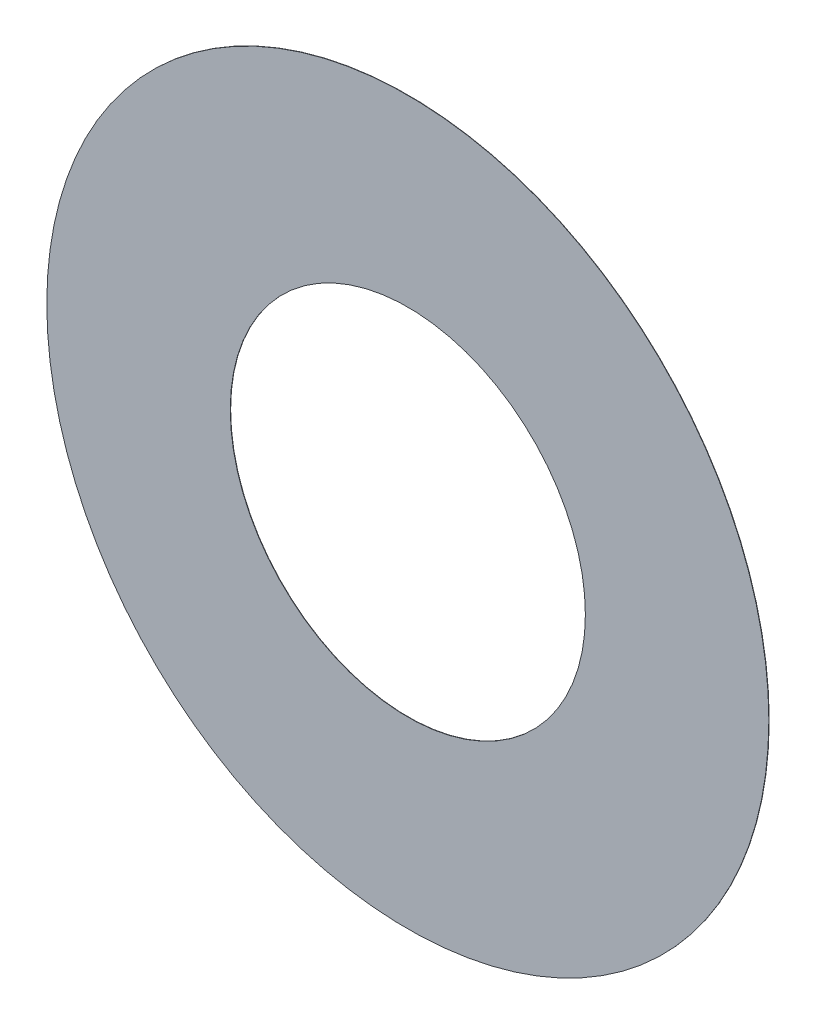
ISO-10303-21;
HEADER;
FILE_DESCRIPTION(('STEP AP214'),'2;1');
FILE_NAME('part.step','',(''),(''),'','','');
FILE_SCHEMA(('AUTOMOTIVE_DESIGN { 1 0 10303 214 1 1 1 1 }'));
ENDSEC;
DATA;
#1=APPLICATION_CONTEXT('core data for automotive mechanical design processes');
#2=APPLICATION_PROTOCOL_DEFINITION('international standard','automotive_design',2000,#1);
#3=PRODUCT_CONTEXT('',#1,'mechanical');
#4=PRODUCT('Part','Part','',(#3));
#5=PRODUCT_RELATED_PRODUCT_CATEGORY('part','',(#4));
#6=PRODUCT_DEFINITION_FORMATION('','',#4);
#7=PRODUCT_DEFINITION_CONTEXT('part definition',#1,'design');
#8=PRODUCT_DEFINITION('design','',#6,#7);
#9=PRODUCT_DEFINITION_SHAPE('','',#8);
#10=(LENGTH_UNIT() NAMED_UNIT(*) SI_UNIT(.MILLI.,.METRE.));
#11=(NAMED_UNIT(*) PLANE_ANGLE_UNIT() SI_UNIT($,.RADIAN.));
#12=(NAMED_UNIT(*) SI_UNIT($,.STERADIAN.) SOLID_ANGLE_UNIT());
#13=UNCERTAINTY_MEASURE_WITH_UNIT(LENGTH_MEASURE(1.E-05),#10,'distance_accuracy_value','');
#14=(GEOMETRIC_REPRESENTATION_CONTEXT(3) GLOBAL_UNCERTAINTY_ASSIGNED_CONTEXT((#13)) GLOBAL_UNIT_ASSIGNED_CONTEXT((#10,
#11,#12)) REPRESENTATION_CONTEXT('',''));
#15=CARTESIAN_POINT('',(0.,0.,0.));
#16=DIRECTION('',(0.,0.,1.));
#17=DIRECTION('',(1.,0.,0.));
#18=AXIS2_PLACEMENT_3D('',#15,#16,#17);
#19=CARTESIAN_POINT('',(0.,0.,0.0761999999999985));
#20=DIRECTION('',(0.,0.,1.));
#21=DIRECTION('',(1.,0.,0.));
#22=AXIS2_PLACEMENT_3D('',#19,#20,#21);
#23=PLANE('',#22);
#24=CARTESIAN_POINT('',(0.,0.,0.0761999999999985));
#25=DIRECTION('',(0.,0.,1.));
#26=DIRECTION('',(1.,0.,0.));
#27=AXIS2_PLACEMENT_3D('',#24,#25,#26);
#28=CIRCLE('',#27,77.47);
#29=CARTESIAN_POINT('',(-77.47,0.,0.0761999999999985));
#30=VERTEX_POINT('',#29);
#31=EDGE_CURVE('E10',#30,#30,#28,.T.);
#32=ORIENTED_EDGE('',*,*,#31,.T.);
#33=EDGE_LOOP('',(#32));
#34=FACE_BOUND('',#33,.T.);
#35=CARTESIAN_POINT('',(0.,0.,0.0761999999999985));
#36=DIRECTION('',(0.,0.,1.));
#37=DIRECTION('',(1.,0.,0.));
#38=AXIS2_PLACEMENT_3D('',#35,#36,#37);
#39=CIRCLE('',#38,38.1);
#40=CARTESIAN_POINT('',(-38.1,0.,0.0761999999999985));
#41=VERTEX_POINT('',#40);
#42=EDGE_CURVE('E41',#41,#41,#39,.T.);
#43=ORIENTED_EDGE('',*,*,#42,.F.);
#44=EDGE_LOOP('',(#43));
#45=FACE_BOUND('',#44,.T.);
#46=ADVANCED_FACE('F30',(#34,#45),#23,.T.);
#47=CARTESIAN_POINT('',(0.,0.,0.));
#48=DIRECTION('',(0.,0.,1.));
#49=DIRECTION('',(1.,0.,0.));
#50=AXIS2_PLACEMENT_3D('',#47,#48,#49);
#51=PLANE('',#50);
#52=CARTESIAN_POINT('',(0.,0.,0.));
#53=DIRECTION('',(0.,0.,1.));
#54=DIRECTION('',(1.,0.,0.));
#55=AXIS2_PLACEMENT_3D('',#52,#53,#54);
#56=CIRCLE('',#55,77.47);
#57=CARTESIAN_POINT('',(-77.47,0.,0.));
#58=VERTEX_POINT('',#57);
#59=EDGE_CURVE('E34',#58,#58,#56,.T.);
#60=ORIENTED_EDGE('',*,*,#59,.F.);
#61=EDGE_LOOP('',(#60));
#62=FACE_BOUND('',#61,.T.);
#63=CARTESIAN_POINT('',(0.,0.,0.));
#64=DIRECTION('',(0.,0.,1.));
#65=DIRECTION('',(1.,0.,0.));
#66=AXIS2_PLACEMENT_3D('',#63,#64,#65);
#67=CIRCLE('',#66,38.1);
#68=CARTESIAN_POINT('',(-38.1,0.,0.));
#69=VERTEX_POINT('',#68);
#70=EDGE_CURVE('E43',#69,#69,#67,.T.);
#71=ORIENTED_EDGE('',*,*,#70,.T.);
#72=EDGE_LOOP('',(#71));
#73=FACE_BOUND('',#72,.T.);
#74=ADVANCED_FACE('F53',(#62,#73),#51,.F.);
#75=CARTESIAN_POINT('',(0.,0.,0.0761999999999985));
#76=DIRECTION('',(0.,0.,-1.));
#77=DIRECTION('',(-1.,0.,0.));
#78=AXIS2_PLACEMENT_3D('',#75,#76,#77);
#79=CYLINDRICAL_SURFACE('',#78,77.47);
#80=CARTESIAN_POINT('',(-77.47,0.,0.0761999999999985));
#81=CARTESIAN_POINT('',(-77.47,0.,0.0754062499999985));
#82=CARTESIAN_POINT('',(-77.47,0.,0.0746124999999985));
#83=CARTESIAN_POINT('',(-77.47,0.,0.0730249999999985));
#84=CARTESIAN_POINT('',(-77.47,0.,0.0722312499999986));
#85=CARTESIAN_POINT('',(-77.47,0.,0.0706437499999986));
#86=CARTESIAN_POINT('',(-77.47,0.,0.0698499999999986));
#87=CARTESIAN_POINT('',(-77.47,0.,0.0682624999999986));
#88=CARTESIAN_POINT('',(-77.47,0.,0.0674687499999987));
#89=CARTESIAN_POINT('',(-77.47,0.,0.0658812499999987));
#90=CARTESIAN_POINT('',(-77.47,0.,0.0650874999999987));
#91=CARTESIAN_POINT('',(-77.47,0.,0.0634999999999987));
#92=CARTESIAN_POINT('',(-77.47,0.,0.0627062499999988));
#93=CARTESIAN_POINT('',(-77.47,0.,0.0611187499999988));
#94=CARTESIAN_POINT('',(-77.47,0.,0.0603249999999988));
#95=CARTESIAN_POINT('',(-77.47,0.,0.0587374999999988));
#96=CARTESIAN_POINT('',(-77.47,0.,0.0579437499999988));
#97=CARTESIAN_POINT('',(-77.47,0.,0.0563562499999989));
#98=CARTESIAN_POINT('',(-77.47,0.,0.0555624999999989));
#99=CARTESIAN_POINT('',(-77.47,0.,0.0539749999999989));
#100=CARTESIAN_POINT('',(-77.47,0.,0.0531812499999989));
#101=CARTESIAN_POINT('',(-77.47,0.,0.051593749999999));
#102=CARTESIAN_POINT('',(-77.47,0.,0.050799999999999));
#103=CARTESIAN_POINT('',(-77.47,0.,0.049212499999999));
#104=CARTESIAN_POINT('',(-77.47,0.,0.048418749999999));
#105=CARTESIAN_POINT('',(-77.47,0.,0.0468312499999991));
#106=CARTESIAN_POINT('',(-77.47,0.,0.0460374999999991));
#107=CARTESIAN_POINT('',(-77.47,0.,0.0444499999999991));
#108=CARTESIAN_POINT('',(-77.47,0.,0.0436562499999991));
#109=CARTESIAN_POINT('',(-77.47,0.,0.0420687499999992));
#110=CARTESIAN_POINT('',(-77.47,0.,0.0412749999999992));
#111=CARTESIAN_POINT('',(-77.47,0.,0.0396874999999992));
#112=CARTESIAN_POINT('',(-77.47,0.,0.0388937499999992));
#113=CARTESIAN_POINT('',(-77.47,0.,0.0373062499999992));
#114=CARTESIAN_POINT('',(-77.47,0.,0.0365124999999993));
#115=CARTESIAN_POINT('',(-77.47,0.,0.0349249999999993));
#116=CARTESIAN_POINT('',(-77.47,0.,0.0341312499999993));
#117=CARTESIAN_POINT('',(-77.47,0.,0.0325437499999993));
#118=CARTESIAN_POINT('',(-77.47,0.,0.0317499999999994));
#119=CARTESIAN_POINT('',(-77.47,0.,0.0301624999999994));
#120=CARTESIAN_POINT('',(-77.47,0.,0.0293687499999994));
#121=CARTESIAN_POINT('',(-77.47,0.,0.0277812499999994));
#122=CARTESIAN_POINT('',(-77.47,0.,0.0269874999999995));
#123=CARTESIAN_POINT('',(-77.47,0.,0.0253999999999995));
#124=CARTESIAN_POINT('',(-77.47,0.,0.0246062499999995));
#125=CARTESIAN_POINT('',(-77.47,0.,0.0230187499999995));
#126=CARTESIAN_POINT('',(-77.47,0.,0.0222249999999995));
#127=CARTESIAN_POINT('',(-77.47,0.,0.0206374999999996));
#128=CARTESIAN_POINT('',(-77.47,0.,0.0198437499999996));
#129=CARTESIAN_POINT('',(-77.47,0.,0.0182562499999996));
#130=CARTESIAN_POINT('',(-77.47,0.,0.0174624999999996));
#131=CARTESIAN_POINT('',(-77.47,0.,0.0158749999999997));
#132=CARTESIAN_POINT('',(-77.47,0.,0.0150812499999997));
#133=CARTESIAN_POINT('',(-77.47,0.,0.0134937499999997));
#134=CARTESIAN_POINT('',(-77.47,0.,0.0126999999999997));
#135=CARTESIAN_POINT('',(-77.47,0.,0.0111124999999998));
#136=CARTESIAN_POINT('',(-77.47,0.,0.0103187499999998));
#137=CARTESIAN_POINT('',(-77.47,0.,0.00873124999999981));
#138=CARTESIAN_POINT('',(-77.47,0.,0.00793749999999983));
#139=CARTESIAN_POINT('',(-77.47,0.,0.00634999999999986));
#140=CARTESIAN_POINT('',(-77.47,0.,0.00555624999999988));
#141=CARTESIAN_POINT('',(-77.47,0.,0.00396874999999991));
#142=CARTESIAN_POINT('',(-77.47,0.,0.00317499999999992));
#143=CARTESIAN_POINT('',(-77.47,0.,0.00158749999999996));
#144=CARTESIAN_POINT('',(-77.47,0.,0.000793749999999971));
#145=CARTESIAN_POINT('',(-77.47,0.,0.));
#146=B_SPLINE_CURVE_WITH_KNOTS('',3,(#80,#81,#82,#83,#84,#85,#86,#87,#88,#89,#90,#91,#92,#93,
#94,#95,#96,#97,#98,#99,#100,#101,#102,#103,#104,#105,#106,#107,#108,#109,#110,#111,#112,#113,
#114,#115,#116,#117,#118,#119,#120,#121,#122,#123,#124,#125,#126,#127,#128,#129,#130,#131,#132,
#133,#134,#135,#136,#137,#138,#139,#140,#141,#142,#143,#144,#145),.UNSPECIFIED.,.F.,.F.,(4,2,2,
2,2,2,2,2,2,2,2,2,2,2,2,2,2,2,2,2,2,2,2,2,2,2,2,2,2,2,2,2,4),(0.,0.00238124999999997,
0.00476249999999992,0.00714374999999987,0.00952499999999983,0.0119062499999998,
0.0142874999999997,0.0166687499999997,0.0190499999999996,0.0214312499999996,0.0238124999999995,
0.0261937499999995,0.0285749999999994,0.0309562499999994,0.0333374999999994,0.0357187499999993,
0.0380999999999993,0.0404812499999992,0.0428624999999992,0.0452437499999991,0.0476249999999991,
0.050006249999999,0.052387499999999,0.0547687499999989,0.0571499999999989,0.0595312499999988,
0.0619124999999988,0.0642937499999987,0.0666749999999987,0.0690562499999986,0.0714374999999986,
0.0738187499999985,0.0761999999999985),.UNSPECIFIED.);
#147=EDGE_CURVE('BSEAM32',#30,#58,#146,.T.);
#148=ORIENTED_EDGE('',*,*,#31,.F.);
#149=ORIENTED_EDGE('',*,*,#59,.T.);
#150=ORIENTED_EDGE('',*,*,#147,.T.);
#151=ORIENTED_EDGE('',*,*,#147,.F.);
#152=EDGE_LOOP('',(#148,#150,#149,#151));
#153=FACE_BOUND('',#152,.T.);
#154=ADVANCED_FACE('F32',(#153),#79,.T.);
#155=CARTESIAN_POINT('',(0.,0.,0.0761999999999985));
#156=DIRECTION('',(0.,0.,-1.));
#157=DIRECTION('',(-1.,0.,0.));
#158=AXIS2_PLACEMENT_3D('',#155,#156,#157);
#159=CYLINDRICAL_SURFACE('',#158,38.1);
#160=CARTESIAN_POINT('',(-38.1,0.,0.0761999999999985));
#161=CARTESIAN_POINT('',(-38.1,0.,0.0754062499999985));
#162=CARTESIAN_POINT('',(-38.1,0.,0.0746124999999985));
#163=CARTESIAN_POINT('',(-38.1,0.,0.0730249999999985));
#164=CARTESIAN_POINT('',(-38.1,0.,0.0722312499999986));
#165=CARTESIAN_POINT('',(-38.1,0.,0.0706437499999986));
#166=CARTESIAN_POINT('',(-38.1,0.,0.0698499999999986));
#167=CARTESIAN_POINT('',(-38.1,0.,0.0682624999999986));
#168=CARTESIAN_POINT('',(-38.1,0.,0.0674687499999987));
#169=CARTESIAN_POINT('',(-38.1,0.,0.0658812499999987));
#170=CARTESIAN_POINT('',(-38.1,0.,0.0650874999999987));
#171=CARTESIAN_POINT('',(-38.1,0.,0.0634999999999987));
#172=CARTESIAN_POINT('',(-38.1,0.,0.0627062499999988));
#173=CARTESIAN_POINT('',(-38.1,0.,0.0611187499999988));
#174=CARTESIAN_POINT('',(-38.1,0.,0.0603249999999988));
#175=CARTESIAN_POINT('',(-38.1,0.,0.0587374999999988));
#176=CARTESIAN_POINT('',(-38.1,0.,0.0579437499999988));
#177=CARTESIAN_POINT('',(-38.1,0.,0.0563562499999989));
#178=CARTESIAN_POINT('',(-38.1,0.,0.0555624999999989));
#179=CARTESIAN_POINT('',(-38.1,0.,0.0539749999999989));
#180=CARTESIAN_POINT('',(-38.1,0.,0.0531812499999989));
#181=CARTESIAN_POINT('',(-38.1,0.,0.051593749999999));
#182=CARTESIAN_POINT('',(-38.1,0.,0.050799999999999));
#183=CARTESIAN_POINT('',(-38.1,0.,0.049212499999999));
#184=CARTESIAN_POINT('',(-38.1,0.,0.048418749999999));
#185=CARTESIAN_POINT('',(-38.1,0.,0.0468312499999991));
#186=CARTESIAN_POINT('',(-38.1,0.,0.0460374999999991));
#187=CARTESIAN_POINT('',(-38.1,0.,0.0444499999999991));
#188=CARTESIAN_POINT('',(-38.1,0.,0.0436562499999991));
#189=CARTESIAN_POINT('',(-38.1,0.,0.0420687499999992));
#190=CARTESIAN_POINT('',(-38.1,0.,0.0412749999999992));
#191=CARTESIAN_POINT('',(-38.1,0.,0.0396874999999992));
#192=CARTESIAN_POINT('',(-38.1,0.,0.0388937499999992));
#193=CARTESIAN_POINT('',(-38.1,0.,0.0373062499999992));
#194=CARTESIAN_POINT('',(-38.1,0.,0.0365124999999993));
#195=CARTESIAN_POINT('',(-38.1,0.,0.0349249999999993));
#196=CARTESIAN_POINT('',(-38.1,0.,0.0341312499999993));
#197=CARTESIAN_POINT('',(-38.1,0.,0.0325437499999993));
#198=CARTESIAN_POINT('',(-38.1,0.,0.0317499999999994));
#199=CARTESIAN_POINT('',(-38.1,0.,0.0301624999999994));
#200=CARTESIAN_POINT('',(-38.1,0.,0.0293687499999994));
#201=CARTESIAN_POINT('',(-38.1,0.,0.0277812499999994));
#202=CARTESIAN_POINT('',(-38.1,0.,0.0269874999999995));
#203=CARTESIAN_POINT('',(-38.1,0.,0.0253999999999995));
#204=CARTESIAN_POINT('',(-38.1,0.,0.0246062499999995));
#205=CARTESIAN_POINT('',(-38.1,0.,0.0230187499999995));
#206=CARTESIAN_POINT('',(-38.1,0.,0.0222249999999995));
#207=CARTESIAN_POINT('',(-38.1,0.,0.0206374999999996));
#208=CARTESIAN_POINT('',(-38.1,0.,0.0198437499999996));
#209=CARTESIAN_POINT('',(-38.1,0.,0.0182562499999996));
#210=CARTESIAN_POINT('',(-38.1,0.,0.0174624999999996));
#211=CARTESIAN_POINT('',(-38.1,0.,0.0158749999999997));
#212=CARTESIAN_POINT('',(-38.1,0.,0.0150812499999997));
#213=CARTESIAN_POINT('',(-38.1,0.,0.0134937499999997));
#214=CARTESIAN_POINT('',(-38.1,0.,0.0126999999999997));
#215=CARTESIAN_POINT('',(-38.1,0.,0.0111124999999998));
#216=CARTESIAN_POINT('',(-38.1,0.,0.0103187499999998));
#217=CARTESIAN_POINT('',(-38.1,0.,0.00873124999999981));
#218=CARTESIAN_POINT('',(-38.1,0.,0.00793749999999983));
#219=CARTESIAN_POINT('',(-38.1,0.,0.00634999999999986));
#220=CARTESIAN_POINT('',(-38.1,0.,0.00555624999999988));
#221=CARTESIAN_POINT('',(-38.1,0.,0.00396874999999991));
#222=CARTESIAN_POINT('',(-38.1,0.,0.00317499999999992));
#223=CARTESIAN_POINT('',(-38.1,0.,0.00158749999999996));
#224=CARTESIAN_POINT('',(-38.1,0.,0.000793749999999971));
#225=CARTESIAN_POINT('',(-38.1,0.,0.));
#226=B_SPLINE_CURVE_WITH_KNOTS('',3,(#160,#161,#162,#163,#164,#165,#166,#167,#168,#169,#170,
#171,#172,#173,#174,#175,#176,#177,#178,#179,#180,#181,#182,#183,#184,#185,#186,#187,#188,#189,
#190,#191,#192,#193,#194,#195,#196,#197,#198,#199,#200,#201,#202,#203,#204,#205,#206,#207,#208,
#209,#210,#211,#212,#213,#214,#215,#216,#217,#218,#219,#220,#221,#222,#223,#224,#225),
.UNSPECIFIED.,.F.,.F.,(4,2,2,2,2,2,2,2,2,2,2,2,2,2,2,2,2,2,2,2,2,2,2,2,2,2,2,2,2,2,2,2,4),(0.,
0.00238124999999997,0.00476249999999992,0.00714374999999987,0.00952499999999983,
0.0119062499999998,0.0142874999999997,0.0166687499999997,0.0190499999999996,0.0214312499999996,
0.0238124999999995,0.0261937499999995,0.0285749999999994,0.0309562499999994,0.0333374999999994,
0.0357187499999993,0.0380999999999993,0.0404812499999992,0.0428624999999992,0.0452437499999991,
0.0476249999999991,0.050006249999999,0.052387499999999,0.0547687499999989,0.0571499999999989,
0.0595312499999988,0.0619124999999988,0.0642937499999987,0.0666749999999987,0.0690562499999986,
0.0714374999999986,0.0738187499999985,0.0761999999999985),.UNSPECIFIED.);
#227=EDGE_CURVE('BSEAM49',#41,#69,#226,.T.);
#228=ORIENTED_EDGE('',*,*,#42,.T.);
#229=ORIENTED_EDGE('',*,*,#70,.F.);
#230=ORIENTED_EDGE('',*,*,#227,.T.);
#231=ORIENTED_EDGE('',*,*,#227,.F.);
#232=EDGE_LOOP('',(#228,#230,#229,#231));
#233=FACE_BOUND('',#232,.T.);
#234=ADVANCED_FACE('F49',(#233),#159,.F.);
#235=CLOSED_SHELL('',(#46,#74,#154,#234));
#236=MANIFOLD_SOLID_BREP('B2',#235);
#237=ADVANCED_BREP_SHAPE_REPRESENTATION('',(#18,#236),#14);
#238=SHAPE_DEFINITION_REPRESENTATION(#9,#237);
ENDSEC;
END-ISO-10303-21;
